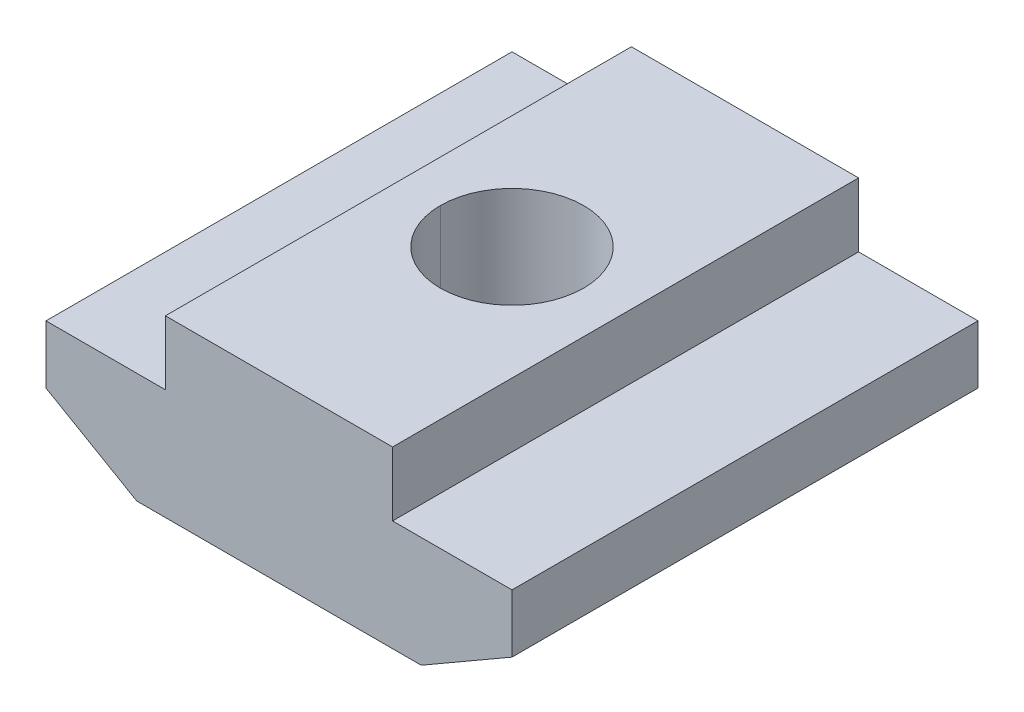
ISO-10303-21;
HEADER;
FILE_DESCRIPTION(('STEP AP214'),'2;1');
FILE_NAME('part.step','',(''),(''),'','','');
FILE_SCHEMA(('AUTOMOTIVE_DESIGN { 1 0 10303 214 1 1 1 1 }'));
ENDSEC;
DATA;
#1=APPLICATION_CONTEXT('core data for automotive mechanical design processes');
#2=APPLICATION_PROTOCOL_DEFINITION('international standard','automotive_design',2000,#1);
#3=PRODUCT_CONTEXT('',#1,'mechanical');
#4=PRODUCT('Part','Part','',(#3));
#5=PRODUCT_RELATED_PRODUCT_CATEGORY('part','',(#4));
#6=PRODUCT_DEFINITION_FORMATION('','',#4);
#7=PRODUCT_DEFINITION_CONTEXT('part definition',#1,'design');
#8=PRODUCT_DEFINITION('design','',#6,#7);
#9=PRODUCT_DEFINITION_SHAPE('','',#8);
#10=(LENGTH_UNIT() NAMED_UNIT(*) SI_UNIT(.MILLI.,.METRE.));
#11=(NAMED_UNIT(*) PLANE_ANGLE_UNIT() SI_UNIT($,.RADIAN.));
#12=(NAMED_UNIT(*) SI_UNIT($,.STERADIAN.) SOLID_ANGLE_UNIT());
#13=UNCERTAINTY_MEASURE_WITH_UNIT(LENGTH_MEASURE(1.E-05),#10,'distance_accuracy_value','');
#14=(GEOMETRIC_REPRESENTATION_CONTEXT(3) GLOBAL_UNCERTAINTY_ASSIGNED_CONTEXT((#13)) GLOBAL_UNIT_ASSIGNED_CONTEXT((#10,
#11,#12)) REPRESENTATION_CONTEXT('',''));
#15=CARTESIAN_POINT('',(0.,0.,0.));
#16=DIRECTION('',(0.,0.,1.));
#17=DIRECTION('',(1.,0.,0.));
#18=AXIS2_PLACEMENT_3D('',#15,#16,#17);
#19=CARTESIAN_POINT('',(-8.,-0.1,0.));
#20=DIRECTION('',(0.50000000000019,0.866025403784329,0.));
#21=DIRECTION('',(0.,0.,-1.));
#22=AXIS2_PLACEMENT_3D('',#19,#20,#21);
#23=PLANE('',#22);
#24=DIRECTION('',(0.,0.,1.));
#25=VECTOR('',#24,1.);
#26=CARTESIAN_POINT('',(-8.,-0.1,0.));
#27=LINE('',#26,#25);
#28=CARTESIAN_POINT('',(-8.,-0.1,-8.));
#29=VERTEX_POINT('',#28);
#30=CARTESIAN_POINT('',(-8.,-0.1,8.));
#31=VERTEX_POINT('',#30);
#32=EDGE_CURVE('E247',#29,#31,#27,.T.);
#33=ORIENTED_EDGE('',*,*,#32,.F.);
#34=DIRECTION('',(0.866025403784329,-0.50000000000019,0.));
#35=VECTOR('',#34,1.);
#36=CARTESIAN_POINT('',(-6.44115427319,-1.,-8.));
#37=LINE('',#36,#35);
#38=CARTESIAN_POINT('',(-4.88230854638,-1.9,-8.));
#39=VERTEX_POINT('',#38);
#40=EDGE_CURVE('E259',#29,#39,#37,.T.);
#41=ORIENTED_EDGE('',*,*,#40,.T.);
#42=DIRECTION('',(0.,0.,1.));
#43=VECTOR('',#42,1.);
#44=CARTESIAN_POINT('',(-4.88230854638,-1.9,0.));
#45=LINE('',#44,#43);
#46=CARTESIAN_POINT('',(-4.88230854638,-1.9,8.));
#47=VERTEX_POINT('',#46);
#48=EDGE_CURVE('E11',#39,#47,#45,.T.);
#49=ORIENTED_EDGE('',*,*,#48,.T.);
#50=DIRECTION('',(-0.866025403784329,0.50000000000019,0.));
#51=VECTOR('',#50,1.);
#52=CARTESIAN_POINT('',(-6.44115427319,-1.,8.));
#53=LINE('',#52,#51);
#54=EDGE_CURVE('E25',#47,#31,#53,.T.);
#55=ORIENTED_EDGE('',*,*,#54,.T.);
#56=EDGE_LOOP('',(#33,#41,#49,#55));
#57=FACE_BOUND('',#56,.T.);
#58=ADVANCED_FACE('F17',(#57),#23,.F.);
#59=CARTESIAN_POINT('',(8.,-1.9,0.));
#60=DIRECTION('',(0.,1.,0.));
#61=DIRECTION('',(1.,0.,0.));
#62=AXIS2_PLACEMENT_3D('',#59,#60,#61);
#63=PLANE('',#62);
#64=CARTESIAN_POINT('',(0.,-1.9,0.));
#65=DIRECTION('',(0.,1.,0.));
#66=DIRECTION('',(1.,0.,0.));
#67=AXIS2_PLACEMENT_3D('',#64,#65,#66);
#68=CIRCLE('',#67,2.4585);
#69=CARTESIAN_POINT('',(-2.4585,-1.9,0.));
#70=VERTEX_POINT('',#69);
#71=CARTESIAN_POINT('',(2.4585,-1.9,0.));
#72=VERTEX_POINT('',#71);
#73=EDGE_CURVE('E144',#70,#72,#68,.T.);
#74=ORIENTED_EDGE('',*,*,#73,.T.);
#75=CARTESIAN_POINT('',(0.,-1.9,0.));
#76=DIRECTION('',(0.,1.,0.));
#77=DIRECTION('',(1.,0.,0.));
#78=AXIS2_PLACEMENT_3D('',#75,#76,#77);
#79=CIRCLE('',#78,2.4585);
#80=EDGE_CURVE('E143',#72,#70,#79,.T.);
#81=ORIENTED_EDGE('',*,*,#80,.T.);
#82=EDGE_LOOP('',(#74,#81));
#83=FACE_BOUND('',#82,.T.);
#84=ORIENTED_EDGE('',*,*,#48,.F.);
#85=DIRECTION('',(1.,0.,0.));
#86=VECTOR('',#85,1.);
#87=CARTESIAN_POINT('',(0.,-1.9,-8.));
#88=LINE('',#87,#86);
#89=CARTESIAN_POINT('',(4.88230854638,-1.9,-8.));
#90=VERTEX_POINT('',#89);
#91=EDGE_CURVE('E262',#39,#90,#88,.T.);
#92=ORIENTED_EDGE('',*,*,#91,.T.);
#93=DIRECTION('',(0.,0.,1.));
#94=VECTOR('',#93,1.);
#95=CARTESIAN_POINT('',(4.88230854638,-1.9,0.));
#96=LINE('',#95,#94);
#97=CARTESIAN_POINT('',(4.88230854638,-1.9,8.));
#98=VERTEX_POINT('',#97);
#99=EDGE_CURVE('E213',#90,#98,#96,.T.);
#100=ORIENTED_EDGE('',*,*,#99,.T.);
#101=DIRECTION('',(1.,0.,0.));
#102=VECTOR('',#101,1.);
#103=CARTESIAN_POINT('',(0.,-1.9,8.));
#104=LINE('',#103,#102);
#105=EDGE_CURVE('E265',#47,#98,#104,.T.);
#106=ORIENTED_EDGE('',*,*,#105,.F.);
#107=EDGE_LOOP('',(#84,#92,#100,#106));
#108=FACE_BOUND('',#107,.T.);
#109=ADVANCED_FACE('F284',(#83,#108),#63,.F.);
#110=CARTESIAN_POINT('',(0.,0.,8.));
#111=DIRECTION('',(0.,0.,1.));
#112=DIRECTION('',(1.,0.,0.));
#113=AXIS2_PLACEMENT_3D('',#110,#111,#112);
#114=PLANE('',#113);
#115=ORIENTED_EDGE('',*,*,#105,.T.);
#116=DIRECTION('',(-0.866025403784329,-0.50000000000019,0.));
#117=VECTOR('',#116,1.);
#118=CARTESIAN_POINT('',(6.44115427319,-1.,8.));
#119=LINE('',#118,#117);
#120=CARTESIAN_POINT('',(8.,-0.1,8.));
#121=VERTEX_POINT('',#120);
#122=EDGE_CURVE('E212',#121,#98,#119,.T.);
#123=ORIENTED_EDGE('',*,*,#122,.F.);
#124=DIRECTION('',(0.,1.,0.));
#125=VECTOR('',#124,1.);
#126=CARTESIAN_POINT('',(8.,0.9,8.));
#127=LINE('',#126,#125);
#128=CARTESIAN_POINT('',(8.,1.9,8.));
#129=VERTEX_POINT('',#128);
#130=EDGE_CURVE('E238',#121,#129,#127,.T.);
#131=ORIENTED_EDGE('',*,*,#130,.T.);
#132=DIRECTION('',(-1.,0.,0.));
#133=VECTOR('',#132,1.);
#134=CARTESIAN_POINT('',(5.95,1.9,8.));
#135=LINE('',#134,#133);
#136=CARTESIAN_POINT('',(3.9,1.9,8.));
#137=VERTEX_POINT('',#136);
#138=EDGE_CURVE('E174',#129,#137,#135,.T.);
#139=ORIENTED_EDGE('',*,*,#138,.T.);
#140=DIRECTION('',(0.,1.,0.));
#141=VECTOR('',#140,1.);
#142=CARTESIAN_POINT('',(3.9,3.,8.));
#143=LINE('',#142,#141);
#144=CARTESIAN_POINT('',(3.9,4.1,8.));
#145=VERTEX_POINT('',#144);
#146=EDGE_CURVE('E221',#137,#145,#143,.T.);
#147=ORIENTED_EDGE('',*,*,#146,.T.);
#148=DIRECTION('',(-1.,0.,0.));
#149=VECTOR('',#148,1.);
#150=CARTESIAN_POINT('',(0.,4.1,8.));
#151=LINE('',#150,#149);
#152=CARTESIAN_POINT('',(-3.9,4.1,8.));
#153=VERTEX_POINT('',#152);
#154=EDGE_CURVE('E228',#145,#153,#151,.T.);
#155=ORIENTED_EDGE('',*,*,#154,.T.);
#156=DIRECTION('',(0.,-1.,0.));
#157=VECTOR('',#156,1.);
#158=CARTESIAN_POINT('',(-3.9,3.,8.));
#159=LINE('',#158,#157);
#160=CARTESIAN_POINT('',(-3.9,1.9,8.));
#161=VERTEX_POINT('',#160);
#162=EDGE_CURVE('E165',#153,#161,#159,.T.);
#163=ORIENTED_EDGE('',*,*,#162,.T.);
#164=DIRECTION('',(-1.,0.,0.));
#165=VECTOR('',#164,1.);
#166=CARTESIAN_POINT('',(-5.95,1.9,8.));
#167=LINE('',#166,#165);
#168=CARTESIAN_POINT('',(-8.,1.9,8.));
#169=VERTEX_POINT('',#168);
#170=EDGE_CURVE('E169',#161,#169,#167,.T.);
#171=ORIENTED_EDGE('',*,*,#170,.T.);
#172=DIRECTION('',(0.,-1.,0.));
#173=VECTOR('',#172,1.);
#174=CARTESIAN_POINT('',(-8.,0.9,8.));
#175=LINE('',#174,#173);
#176=EDGE_CURVE('E251',#169,#31,#175,.T.);
#177=ORIENTED_EDGE('',*,*,#176,.T.);
#178=ORIENTED_EDGE('',*,*,#54,.F.);
#179=EDGE_LOOP('',(#115,#123,#131,#139,#147,#155,#163,#171,#177,#178));
#180=FACE_BOUND('',#179,.T.);
#181=ADVANCED_FACE('F271',(#180),#114,.T.);
#182=CARTESIAN_POINT('',(0.,0.,-8.));
#183=DIRECTION('',(0.,0.,1.));
#184=DIRECTION('',(1.,0.,0.));
#185=AXIS2_PLACEMENT_3D('',#182,#183,#184);
#186=PLANE('',#185);
#187=ORIENTED_EDGE('',*,*,#40,.F.);
#188=DIRECTION('',(0.,-1.,0.));
#189=VECTOR('',#188,1.);
#190=CARTESIAN_POINT('',(-8.,0.9,-8.));
#191=LINE('',#190,#189);
#192=CARTESIAN_POINT('',(-8.,1.9,-8.));
#193=VERTEX_POINT('',#192);
#194=EDGE_CURVE('E255',#193,#29,#191,.T.);
#195=ORIENTED_EDGE('',*,*,#194,.F.);
#196=DIRECTION('',(-1.,0.,0.));
#197=VECTOR('',#196,1.);
#198=CARTESIAN_POINT('',(-5.95,1.9,-8.));
#199=LINE('',#198,#197);
#200=CARTESIAN_POINT('',(-3.9,1.9,-8.));
#201=VERTEX_POINT('',#200);
#202=EDGE_CURVE('E183',#201,#193,#199,.T.);
#203=ORIENTED_EDGE('',*,*,#202,.F.);
#204=DIRECTION('',(0.,-1.,0.));
#205=VECTOR('',#204,1.);
#206=CARTESIAN_POINT('',(-3.9,3.,-8.));
#207=LINE('',#206,#205);
#208=CARTESIAN_POINT('',(-3.9,4.1,-8.));
#209=VERTEX_POINT('',#208);
#210=EDGE_CURVE('E162',#209,#201,#207,.T.);
#211=ORIENTED_EDGE('',*,*,#210,.F.);
#212=DIRECTION('',(-1.,0.,0.));
#213=VECTOR('',#212,1.);
#214=CARTESIAN_POINT('',(0.,4.1,-8.));
#215=LINE('',#214,#213);
#216=CARTESIAN_POINT('',(3.9,4.1,-8.));
#217=VERTEX_POINT('',#216);
#218=EDGE_CURVE('E225',#217,#209,#215,.T.);
#219=ORIENTED_EDGE('',*,*,#218,.F.);
#220=DIRECTION('',(0.,1.,0.));
#221=VECTOR('',#220,1.);
#222=CARTESIAN_POINT('',(3.9,3.,-8.));
#223=LINE('',#222,#221);
#224=CARTESIAN_POINT('',(3.9,1.9,-8.));
#225=VERTEX_POINT('',#224);
#226=EDGE_CURVE('E208',#225,#217,#223,.T.);
#227=ORIENTED_EDGE('',*,*,#226,.F.);
#228=DIRECTION('',(-1.,0.,0.));
#229=VECTOR('',#228,1.);
#230=CARTESIAN_POINT('',(5.95,1.9,-8.));
#231=LINE('',#230,#229);
#232=CARTESIAN_POINT('',(8.,1.9,-8.));
#233=VERTEX_POINT('',#232);
#234=EDGE_CURVE('E188',#233,#225,#231,.T.);
#235=ORIENTED_EDGE('',*,*,#234,.F.);
#236=DIRECTION('',(0.,1.,0.));
#237=VECTOR('',#236,1.);
#238=CARTESIAN_POINT('',(8.,0.9,-8.));
#239=LINE('',#238,#237);
#240=CARTESIAN_POINT('',(8.,-0.1,-8.));
#241=VERTEX_POINT('',#240);
#242=EDGE_CURVE('E235',#241,#233,#239,.T.);
#243=ORIENTED_EDGE('',*,*,#242,.F.);
#244=DIRECTION('',(0.866025403784329,0.50000000000019,0.));
#245=VECTOR('',#244,1.);
#246=CARTESIAN_POINT('',(6.44115427319,-1.,-8.));
#247=LINE('',#246,#245);
#248=EDGE_CURVE('E209',#90,#241,#247,.T.);
#249=ORIENTED_EDGE('',*,*,#248,.F.);
#250=ORIENTED_EDGE('',*,*,#91,.F.);
#251=EDGE_LOOP('',(#187,#195,#203,#211,#219,#227,#235,#243,#249,#250));
#252=FACE_BOUND('',#251,.T.);
#253=ADVANCED_FACE('F278',(#252),#186,.F.);
#254=CARTESIAN_POINT('',(-8.,-1.9,0.));
#255=DIRECTION('',(1.,0.,0.));
#256=DIRECTION('',(0.,1.,0.));
#257=AXIS2_PLACEMENT_3D('',#254,#255,#256);
#258=PLANE('',#257);
#259=ORIENTED_EDGE('',*,*,#32,.T.);
#260=ORIENTED_EDGE('',*,*,#176,.F.);
#261=DIRECTION('',(0.,0.,1.));
#262=VECTOR('',#261,1.);
#263=CARTESIAN_POINT('',(-8.,1.9,0.));
#264=LINE('',#263,#262);
#265=EDGE_CURVE('E172',#193,#169,#264,.T.);
#266=ORIENTED_EDGE('',*,*,#265,.F.);
#267=ORIENTED_EDGE('',*,*,#194,.T.);
#268=EDGE_LOOP('',(#259,#260,#266,#267));
#269=FACE_BOUND('',#268,.T.);
#270=ADVANCED_FACE('F275',(#269),#258,.F.);
#271=CARTESIAN_POINT('',(8.,-0.1,0.));
#272=DIRECTION('',(-0.50000000000019,0.866025403784329,0.));
#273=DIRECTION('',(0.,0.,1.));
#274=AXIS2_PLACEMENT_3D('',#271,#272,#273);
#275=PLANE('',#274);
#276=ORIENTED_EDGE('',*,*,#99,.F.);
#277=ORIENTED_EDGE('',*,*,#248,.T.);
#278=DIRECTION('',(0.,0.,1.));
#279=VECTOR('',#278,1.);
#280=CARTESIAN_POINT('',(8.,-0.1,0.));
#281=LINE('',#280,#279);
#282=EDGE_CURVE('E231',#241,#121,#281,.T.);
#283=ORIENTED_EDGE('',*,*,#282,.T.);
#284=ORIENTED_EDGE('',*,*,#122,.T.);
#285=EDGE_LOOP('',(#276,#277,#283,#284));
#286=FACE_BOUND('',#285,.T.);
#287=ADVANCED_FACE('F286',(#286),#275,.F.);
#288=CARTESIAN_POINT('',(8.,1.9,0.));
#289=DIRECTION('',(-1.,0.,0.));
#290=DIRECTION('',(0.,0.,1.));
#291=AXIS2_PLACEMENT_3D('',#288,#289,#290);
#292=PLANE('',#291);
#293=ORIENTED_EDGE('',*,*,#282,.F.);
#294=ORIENTED_EDGE('',*,*,#242,.T.);
#295=DIRECTION('',(0.,0.,1.));
#296=VECTOR('',#295,1.);
#297=CARTESIAN_POINT('',(8.,1.9,0.));
#298=LINE('',#297,#296);
#299=EDGE_CURVE('E184',#233,#129,#298,.T.);
#300=ORIENTED_EDGE('',*,*,#299,.T.);
#301=ORIENTED_EDGE('',*,*,#130,.F.);
#302=EDGE_LOOP('',(#293,#294,#300,#301));
#303=FACE_BOUND('',#302,.T.);
#304=ADVANCED_FACE('F291',(#303),#292,.F.);
#305=CARTESIAN_POINT('',(-3.9,4.1,0.));
#306=DIRECTION('',(0.,-1.,0.));
#307=DIRECTION('',(0.,0.,-1.));
#308=AXIS2_PLACEMENT_3D('',#305,#306,#307);
#309=PLANE('',#308);
#310=CARTESIAN_POINT('',(0.,4.1,0.));
#311=DIRECTION('',(0.,-1.,0.));
#312=DIRECTION('',(1.,0.,0.));
#313=AXIS2_PLACEMENT_3D('',#310,#311,#312);
#314=CIRCLE('',#313,2.4585);
#315=CARTESIAN_POINT('',(2.4585,4.1,0.));
#316=VERTEX_POINT('',#315);
#317=CARTESIAN_POINT('',(-2.4585,4.1,0.));
#318=VERTEX_POINT('',#317);
#319=EDGE_CURVE('E146',#316,#318,#314,.T.);
#320=ORIENTED_EDGE('',*,*,#319,.T.);
#321=CARTESIAN_POINT('',(0.,4.1,0.));
#322=DIRECTION('',(0.,-1.,0.));
#323=DIRECTION('',(1.,0.,0.));
#324=AXIS2_PLACEMENT_3D('',#321,#322,#323);
#325=CIRCLE('',#324,2.4585);
#326=EDGE_CURVE('E133',#318,#316,#325,.T.);
#327=ORIENTED_EDGE('',*,*,#326,.T.);
#328=EDGE_LOOP('',(#320,#327));
#329=FACE_BOUND('',#328,.T.);
#330=DIRECTION('',(0.,0.,1.));
#331=VECTOR('',#330,1.);
#332=CARTESIAN_POINT('',(3.9,4.1,0.));
#333=LINE('',#332,#331);
#334=EDGE_CURVE('E217',#217,#145,#333,.T.);
#335=ORIENTED_EDGE('',*,*,#334,.F.);
#336=ORIENTED_EDGE('',*,*,#218,.T.);
#337=DIRECTION('',(0.,0.,1.));
#338=VECTOR('',#337,1.);
#339=CARTESIAN_POINT('',(-3.9,4.1,0.));
#340=LINE('',#339,#338);
#341=EDGE_CURVE('E166',#209,#153,#340,.T.);
#342=ORIENTED_EDGE('',*,*,#341,.T.);
#343=ORIENTED_EDGE('',*,*,#154,.F.);
#344=EDGE_LOOP('',(#335,#336,#342,#343));
#345=FACE_BOUND('',#344,.T.);
#346=ADVANCED_FACE('F147',(#329,#345),#309,.F.);
#347=CARTESIAN_POINT('',(3.9,4.1,0.));
#348=DIRECTION('',(-1.,0.,0.));
#349=DIRECTION('',(0.,0.,1.));
#350=AXIS2_PLACEMENT_3D('',#347,#348,#349);
#351=PLANE('',#350);
#352=DIRECTION('',(0.,0.,1.));
#353=VECTOR('',#352,1.);
#354=CARTESIAN_POINT('',(3.9,1.9,0.));
#355=LINE('',#354,#353);
#356=EDGE_CURVE('E179',#225,#137,#355,.T.);
#357=ORIENTED_EDGE('',*,*,#356,.F.);
#358=ORIENTED_EDGE('',*,*,#226,.T.);
#359=ORIENTED_EDGE('',*,*,#334,.T.);
#360=ORIENTED_EDGE('',*,*,#146,.F.);
#361=EDGE_LOOP('',(#357,#358,#359,#360));
#362=FACE_BOUND('',#361,.T.);
#363=ADVANCED_FACE('F300',(#362),#351,.F.);
#364=CARTESIAN_POINT('',(-3.9,1.9,0.));
#365=DIRECTION('',(1.,0.,0.));
#366=DIRECTION('',(0.,1.,0.));
#367=AXIS2_PLACEMENT_3D('',#364,#365,#366);
#368=PLANE('',#367);
#369=ORIENTED_EDGE('',*,*,#341,.F.);
#370=ORIENTED_EDGE('',*,*,#210,.T.);
#371=DIRECTION('',(0.,0.,1.));
#372=VECTOR('',#371,1.);
#373=CARTESIAN_POINT('',(-3.9,1.9,0.));
#374=LINE('',#373,#372);
#375=EDGE_CURVE('E178',#201,#161,#374,.T.);
#376=ORIENTED_EDGE('',*,*,#375,.T.);
#377=ORIENTED_EDGE('',*,*,#162,.F.);
#378=EDGE_LOOP('',(#369,#370,#376,#377));
#379=FACE_BOUND('',#378,.T.);
#380=ADVANCED_FACE('F303',(#379),#368,.F.);
#381=CARTESIAN_POINT('',(3.9,1.9,0.));
#382=DIRECTION('',(0.,-1.,0.));
#383=DIRECTION('',(0.,0.,-1.));
#384=AXIS2_PLACEMENT_3D('',#381,#382,#383);
#385=PLANE('',#384);
#386=ORIENTED_EDGE('',*,*,#375,.F.);
#387=ORIENTED_EDGE('',*,*,#202,.T.);
#388=ORIENTED_EDGE('',*,*,#265,.T.);
#389=ORIENTED_EDGE('',*,*,#170,.F.);
#390=EDGE_LOOP('',(#386,#387,#388,#389));
#391=FACE_BOUND('',#390,.T.);
#392=ADVANCED_FACE('F305',(#391),#385,.F.);
#393=CARTESIAN_POINT('',(3.9,1.9,0.));
#394=DIRECTION('',(0.,-1.,0.));
#395=DIRECTION('',(0.,0.,-1.));
#396=AXIS2_PLACEMENT_3D('',#393,#394,#395);
#397=PLANE('',#396);
#398=ORIENTED_EDGE('',*,*,#299,.F.);
#399=ORIENTED_EDGE('',*,*,#234,.T.);
#400=ORIENTED_EDGE('',*,*,#356,.T.);
#401=ORIENTED_EDGE('',*,*,#138,.F.);
#402=EDGE_LOOP('',(#398,#399,#400,#401));
#403=FACE_BOUND('',#402,.T.);
#404=ADVANCED_FACE('F295',(#403),#397,.F.);
#405=CARTESIAN_POINT('',(0.,-1.9,0.));
#406=DIRECTION('',(0.,1.,0.));
#407=DIRECTION('',(1.,0.,0.));
#408=AXIS2_PLACEMENT_3D('',#405,#406,#407);
#409=CYLINDRICAL_SURFACE('',#408,2.4585);
#410=DIRECTION('',(0.,-1.,0.));
#411=VECTOR('',#410,1.);
#412=CARTESIAN_POINT('',(2.4585,2.94499999997,0.));
#413=LINE('',#412,#411);
#414=EDGE_CURVE('E139',#316,#72,#413,.T.);
#415=ORIENTED_EDGE('',*,*,#414,.F.);
#416=ORIENTED_EDGE('',*,*,#326,.F.);
#417=DIRECTION('',(0.,-1.,0.));
#418=VECTOR('',#417,1.);
#419=CARTESIAN_POINT('',(-2.4585,2.94499999997,0.));
#420=LINE('',#419,#418);
#421=EDGE_CURVE('E137',#318,#70,#420,.T.);
#422=ORIENTED_EDGE('',*,*,#421,.T.);
#423=ORIENTED_EDGE('',*,*,#80,.F.);
#424=EDGE_LOOP('',(#415,#416,#422,#423));
#425=FACE_BOUND('',#424,.T.);
#426=ADVANCED_FACE('F135',(#425),#409,.F.);
#427=CARTESIAN_POINT('',(0.,-1.9,0.));
#428=DIRECTION('',(0.,1.,0.));
#429=DIRECTION('',(1.,0.,0.));
#430=AXIS2_PLACEMENT_3D('',#427,#428,#429);
#431=CYLINDRICAL_SURFACE('',#430,2.4585);
#432=ORIENTED_EDGE('',*,*,#421,.F.);
#433=ORIENTED_EDGE('',*,*,#319,.F.);
#434=ORIENTED_EDGE('',*,*,#414,.T.);
#435=ORIENTED_EDGE('',*,*,#73,.F.);
#436=EDGE_LOOP('',(#432,#433,#434,#435));
#437=FACE_BOUND('',#436,.T.);
#438=ADVANCED_FACE('F153',(#437),#431,.F.);
#439=CLOSED_SHELL('',(#58,#109,#181,#253,#270,#287,#304,#346,#363,#380,#392,#404,#426,#438));
#440=MANIFOLD_SOLID_BREP('B1',#439);
#441=ADVANCED_BREP_SHAPE_REPRESENTATION('',(#18,#440),#14);
#442=SHAPE_DEFINITION_REPRESENTATION(#9,#441);
ENDSEC;
END-ISO-10303-21;
